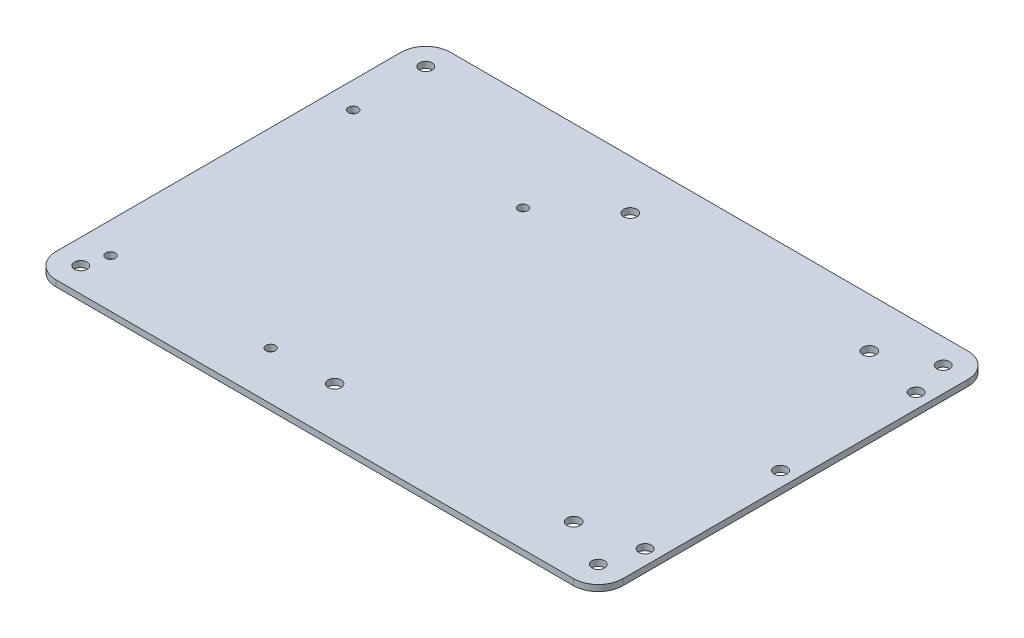
ISO-10303-21;
HEADER;
FILE_DESCRIPTION(('STEP AP214'),'2;1');
FILE_NAME('part.step','',(''),(''),'','','');
FILE_SCHEMA(('AUTOMOTIVE_DESIGN { 1 0 10303 214 1 1 1 1 }'));
ENDSEC;
DATA;
#1=APPLICATION_CONTEXT('core data for automotive mechanical design processes');
#2=APPLICATION_PROTOCOL_DEFINITION('international standard','automotive_design',2000,#1);
#3=PRODUCT_CONTEXT('',#1,'mechanical');
#4=PRODUCT('Part','Part','',(#3));
#5=PRODUCT_RELATED_PRODUCT_CATEGORY('part','',(#4));
#6=PRODUCT_DEFINITION_FORMATION('','',#4);
#7=PRODUCT_DEFINITION_CONTEXT('part definition',#1,'design');
#8=PRODUCT_DEFINITION('design','',#6,#7);
#9=PRODUCT_DEFINITION_SHAPE('','',#8);
#10=(LENGTH_UNIT() NAMED_UNIT(*) SI_UNIT(.MILLI.,.METRE.));
#11=(NAMED_UNIT(*) PLANE_ANGLE_UNIT() SI_UNIT($,.RADIAN.));
#12=(NAMED_UNIT(*) SI_UNIT($,.STERADIAN.) SOLID_ANGLE_UNIT());
#13=UNCERTAINTY_MEASURE_WITH_UNIT(LENGTH_MEASURE(1.E-05),#10,'distance_accuracy_value','');
#14=(GEOMETRIC_REPRESENTATION_CONTEXT(3) GLOBAL_UNCERTAINTY_ASSIGNED_CONTEXT((#13)) GLOBAL_UNIT_ASSIGNED_CONTEXT((#10,
#11,#12)) REPRESENTATION_CONTEXT('',''));
#15=CARTESIAN_POINT('',(0.,0.,0.));
#16=DIRECTION('',(0.,0.,1.));
#17=DIRECTION('',(1.,0.,0.));
#18=AXIS2_PLACEMENT_3D('',#15,#16,#17);
#19=CARTESIAN_POINT('',(73.0249999999999,1.5875,-50.8));
#20=DIRECTION('',(0.,-1.,0.));
#21=DIRECTION('',(0.,0.,-1.));
#22=AXIS2_PLACEMENT_3D('',#19,#20,#21);
#23=PLANE('',#22);
#24=CARTESIAN_POINT('',(-66.3194,1.5875,-25.4));
#25=DIRECTION('',(0.,-1.,0.));
#26=DIRECTION('',(0.,0.,-1.));
#27=AXIS2_PLACEMENT_3D('',#24,#25,#26);
#28=CIRCLE('',#27,1.2192);
#29=CARTESIAN_POINT('',(-66.3194,1.5875,-26.6192));
#30=VERTEX_POINT('',#29);
#31=EDGE_CURVE('E420',#30,#30,#28,.T.);
#32=ORIENTED_EDGE('',*,*,#31,.T.);
#33=EDGE_LOOP('',(#32));
#34=FACE_BOUND('',#33,.T.);
#35=CARTESIAN_POINT('',(-22.5806,1.5875,-25.4));
#36=DIRECTION('',(0.,-1.,0.));
#37=DIRECTION('',(0.,0.,-1.));
#38=AXIS2_PLACEMENT_3D('',#35,#36,#37);
#39=CIRCLE('',#38,1.21919999999999);
#40=CARTESIAN_POINT('',(-22.5806,1.5875,-26.6192));
#41=VERTEX_POINT('',#40);
#42=EDGE_CURVE('E430',#41,#41,#39,.T.);
#43=ORIENTED_EDGE('',*,*,#42,.T.);
#44=EDGE_LOOP('',(#43));
#45=FACE_BOUND('',#44,.T.);
#46=CARTESIAN_POINT('',(-65.0875,1.5875,38.3794));
#47=DIRECTION('',(0.,-1.,0.));
#48=DIRECTION('',(0.,0.,-1.));
#49=AXIS2_PLACEMENT_3D('',#46,#47,#48);
#50=CIRCLE('',#49,1.2192);
#51=CARTESIAN_POINT('',(-65.0875,1.5875,37.1602));
#52=VERTEX_POINT('',#51);
#53=EDGE_CURVE('E436',#52,#52,#50,.T.);
#54=ORIENTED_EDGE('',*,*,#53,.T.);
#55=EDGE_LOOP('',(#54));
#56=FACE_BOUND('',#55,.T.);
#57=CARTESIAN_POINT('',(-23.8125,1.5875,38.3794));
#58=DIRECTION('',(0.,-1.,0.));
#59=DIRECTION('',(0.,0.,-1.));
#60=AXIS2_PLACEMENT_3D('',#57,#58,#59);
#61=CIRCLE('',#60,1.21919999999999);
#62=CARTESIAN_POINT('',(-23.8125,1.5875,37.1602));
#63=VERTEX_POINT('',#62);
#64=EDGE_CURVE('E442',#63,#63,#61,.T.);
#65=ORIENTED_EDGE('',*,*,#64,.T.);
#66=EDGE_LOOP('',(#65));
#67=FACE_BOUND('',#66,.T.);
#68=CARTESIAN_POINT('',(69.215,1.5875,34.925));
#69=DIRECTION('',(0.,1.,0.));
#70=DIRECTION('',(0.,0.,1.));
#71=AXIS2_PLACEMENT_3D('',#68,#69,#70);
#72=CIRCLE('',#71,1.63194999999999);
#73=CARTESIAN_POINT('',(69.215,1.5875,36.55695));
#74=VERTEX_POINT('',#73);
#75=EDGE_CURVE('E451',#74,#74,#72,.T.);
#76=ORIENTED_EDGE('',*,*,#75,.F.);
#77=EDGE_LOOP('',(#76));
#78=FACE_BOUND('',#77,.T.);
#79=CARTESIAN_POINT('',(-7.62000000000004,1.5875,-38.1));
#80=DIRECTION('',(0.,1.,0.));
#81=DIRECTION('',(0.,0.,1.));
#82=AXIS2_PLACEMENT_3D('',#79,#80,#81);
#83=CIRCLE('',#82,1.69999999999999);
#84=CARTESIAN_POINT('',(-7.62000000000004,1.5875,-36.4));
#85=VERTEX_POINT('',#84);
#86=EDGE_CURVE('E463',#85,#85,#83,.T.);
#87=ORIENTED_EDGE('',*,*,#86,.F.);
#88=EDGE_LOOP('',(#87));
#89=FACE_BOUND('',#88,.T.);
#90=CARTESIAN_POINT('',(-7.62000000000004,1.5875,38.1));
#91=DIRECTION('',(0.,1.,0.));
#92=DIRECTION('',(0.,0.,1.));
#93=AXIS2_PLACEMENT_3D('',#90,#91,#92);
#94=CIRCLE('',#93,1.69999999999999);
#95=CARTESIAN_POINT('',(-7.62000000000004,1.5875,39.8));
#96=VERTEX_POINT('',#95);
#97=EDGE_CURVE('E475',#96,#96,#94,.T.);
#98=ORIENTED_EDGE('',*,*,#97,.F.);
#99=EDGE_LOOP('',(#98));
#100=FACE_BOUND('',#99,.T.);
#101=DIRECTION('',(-1.,0.,0.));
#102=VECTOR('',#101,1.);
#103=CARTESIAN_POINT('',(-73.025,1.5875,-50.8));
#104=LINE('',#103,#102);
#105=CARTESIAN_POINT('',(66.675,1.5875,-50.8));
#106=VERTEX_POINT('',#105);
#107=CARTESIAN_POINT('',(-66.675,1.5875,-50.8));
#108=VERTEX_POINT('',#107);
#109=EDGE_CURVE('E183',#106,#108,#104,.T.);
#110=ORIENTED_EDGE('',*,*,#109,.T.);
#111=CARTESIAN_POINT('',(-66.675,1.5875,-44.45));
#112=DIRECTION('',(0.,-1.,0.));
#113=DIRECTION('',(0.,0.,-1.));
#114=AXIS2_PLACEMENT_3D('',#111,#112,#113);
#115=CIRCLE('',#114,6.35);
#116=CARTESIAN_POINT('',(-73.025,1.5875,-44.45));
#117=VERTEX_POINT('',#116);
#118=EDGE_CURVE('E148',#108,#117,#115,.F.);
#119=ORIENTED_EDGE('',*,*,#118,.T.);
#120=DIRECTION('',(0.,0.,1.));
#121=VECTOR('',#120,1.);
#122=CARTESIAN_POINT('',(-73.025,1.5875,50.8));
#123=LINE('',#122,#121);
#124=CARTESIAN_POINT('',(-73.025,1.5875,44.45));
#125=VERTEX_POINT('',#124);
#126=EDGE_CURVE('E119',#117,#125,#123,.T.);
#127=ORIENTED_EDGE('',*,*,#126,.T.);
#128=CARTESIAN_POINT('',(-66.675,1.5875,44.45));
#129=DIRECTION('',(0.,-1.,0.));
#130=DIRECTION('',(0.,0.,-1.));
#131=AXIS2_PLACEMENT_3D('',#128,#129,#130);
#132=CIRCLE('',#131,6.35);
#133=CARTESIAN_POINT('',(-66.675,1.5875,50.8));
#134=VERTEX_POINT('',#133);
#135=EDGE_CURVE('E55',#125,#134,#132,.F.);
#136=ORIENTED_EDGE('',*,*,#135,.T.);
#137=DIRECTION('',(1.,0.,0.));
#138=VECTOR('',#137,1.);
#139=CARTESIAN_POINT('',(-73.025,1.5875,50.8));
#140=LINE('',#139,#138);
#141=CARTESIAN_POINT('',(66.675,1.5875,50.8));
#142=VERTEX_POINT('',#141);
#143=EDGE_CURVE('E135',#134,#142,#140,.T.);
#144=ORIENTED_EDGE('',*,*,#143,.T.);
#145=CARTESIAN_POINT('',(66.675,1.5875,44.45));
#146=DIRECTION('',(0.,-1.,0.));
#147=DIRECTION('',(0.,0.,-1.));
#148=AXIS2_PLACEMENT_3D('',#145,#146,#147);
#149=CIRCLE('',#148,6.35);
#150=CARTESIAN_POINT('',(73.0249999999999,1.5875,44.45));
#151=VERTEX_POINT('',#150);
#152=EDGE_CURVE('E143',#142,#151,#149,.F.);
#153=ORIENTED_EDGE('',*,*,#152,.T.);
#154=DIRECTION('',(0.,0.,-1.));
#155=VECTOR('',#154,1.);
#156=CARTESIAN_POINT('',(73.0249999999999,1.5875,50.8));
#157=LINE('',#156,#155);
#158=CARTESIAN_POINT('',(73.0249999999999,1.5875,-44.45));
#159=VERTEX_POINT('',#158);
#160=EDGE_CURVE('E129',#151,#159,#157,.T.);
#161=ORIENTED_EDGE('',*,*,#160,.T.);
#162=CARTESIAN_POINT('',(66.675,1.5875,-44.45));
#163=DIRECTION('',(0.,-1.,0.));
#164=DIRECTION('',(0.,0.,-1.));
#165=AXIS2_PLACEMENT_3D('',#162,#163,#164);
#166=CIRCLE('',#165,6.35);
#167=EDGE_CURVE('E146',#159,#106,#166,.F.);
#168=ORIENTED_EDGE('',*,*,#167,.T.);
#169=EDGE_LOOP('',(#110,#119,#127,#136,#144,#153,#161,#168));
#170=FACE_BOUND('',#169,.T.);
#171=CARTESIAN_POINT('',(-66.675,1.5875,44.45));
#172=DIRECTION('',(0.,1.,0.));
#173=DIRECTION('',(0.,0.,1.));
#174=AXIS2_PLACEMENT_3D('',#171,#172,#173);
#175=CIRCLE('',#174,1.63194999999999);
#176=CARTESIAN_POINT('',(-66.675,1.5875,46.08195));
#177=VERTEX_POINT('',#176);
#178=EDGE_CURVE('E159',#177,#177,#175,.T.);
#179=ORIENTED_EDGE('',*,*,#178,.F.);
#180=EDGE_LOOP('',(#179));
#181=FACE_BOUND('',#180,.T.);
#182=CARTESIAN_POINT('',(-66.675,1.5875,-44.45));
#183=DIRECTION('',(0.,1.,0.));
#184=DIRECTION('',(0.,0.,1.));
#185=AXIS2_PLACEMENT_3D('',#182,#183,#184);
#186=CIRCLE('',#185,1.63194999999999);
#187=CARTESIAN_POINT('',(-66.675,1.5875,-42.81805));
#188=VERTEX_POINT('',#187);
#189=EDGE_CURVE('E162',#188,#188,#186,.T.);
#190=ORIENTED_EDGE('',*,*,#189,.F.);
#191=EDGE_LOOP('',(#190));
#192=FACE_BOUND('',#191,.T.);
#193=CARTESIAN_POINT('',(66.675,1.5875,-44.45));
#194=DIRECTION('',(0.,1.,0.));
#195=DIRECTION('',(0.,0.,1.));
#196=AXIS2_PLACEMENT_3D('',#193,#194,#195);
#197=CIRCLE('',#196,1.63194999999999);
#198=CARTESIAN_POINT('',(66.675,1.5875,-42.81805));
#199=VERTEX_POINT('',#198);
#200=EDGE_CURVE('E165',#199,#199,#197,.T.);
#201=ORIENTED_EDGE('',*,*,#200,.F.);
#202=EDGE_LOOP('',(#201));
#203=FACE_BOUND('',#202,.T.);
#204=CARTESIAN_POINT('',(66.675,1.5875,44.45));
#205=DIRECTION('',(0.,1.,0.));
#206=DIRECTION('',(0.,0.,1.));
#207=AXIS2_PLACEMENT_3D('',#204,#205,#206);
#208=CIRCLE('',#207,1.63194999999999);
#209=CARTESIAN_POINT('',(66.675,1.5875,46.08195));
#210=VERTEX_POINT('',#209);
#211=EDGE_CURVE('E175',#210,#210,#208,.T.);
#212=ORIENTED_EDGE('',*,*,#211,.F.);
#213=EDGE_LOOP('',(#212));
#214=FACE_BOUND('',#213,.T.);
#215=CARTESIAN_POINT('',(53.975,1.5875,38.1));
#216=DIRECTION('',(0.,1.,0.));
#217=DIRECTION('',(0.,0.,1.));
#218=AXIS2_PLACEMENT_3D('',#215,#216,#217);
#219=CIRCLE('',#218,1.69999999999999);
#220=CARTESIAN_POINT('',(53.975,1.5875,39.8));
#221=VERTEX_POINT('',#220);
#222=EDGE_CURVE('E481',#221,#221,#219,.T.);
#223=ORIENTED_EDGE('',*,*,#222,.F.);
#224=EDGE_LOOP('',(#223));
#225=FACE_BOUND('',#224,.T.);
#226=CARTESIAN_POINT('',(53.975,1.5875,-38.1));
#227=DIRECTION('',(0.,1.,0.));
#228=DIRECTION('',(0.,0.,1.));
#229=AXIS2_PLACEMENT_3D('',#226,#227,#228);
#230=CIRCLE('',#229,1.69999999999999);
#231=CARTESIAN_POINT('',(53.975,1.5875,-36.4));
#232=VERTEX_POINT('',#231);
#233=EDGE_CURVE('E469',#232,#232,#230,.T.);
#234=ORIENTED_EDGE('',*,*,#233,.F.);
#235=EDGE_LOOP('',(#234));
#236=FACE_BOUND('',#235,.T.);
#237=CARTESIAN_POINT('',(69.2149999999999,1.5875,-34.925));
#238=DIRECTION('',(0.,1.,0.));
#239=DIRECTION('',(0.,0.,1.));
#240=AXIS2_PLACEMENT_3D('',#237,#238,#239);
#241=CIRCLE('',#240,1.63194999999999);
#242=CARTESIAN_POINT('',(69.2149999999999,1.5875,-33.29305));
#243=VERTEX_POINT('',#242);
#244=EDGE_CURVE('E457',#243,#243,#241,.T.);
#245=ORIENTED_EDGE('',*,*,#244,.F.);
#246=EDGE_LOOP('',(#245));
#247=FACE_BOUND('',#246,.T.);
#248=CARTESIAN_POINT('',(69.215,1.5875,0.));
#249=DIRECTION('',(0.,1.,0.));
#250=DIRECTION('',(0.,0.,1.));
#251=AXIS2_PLACEMENT_3D('',#248,#249,#250);
#252=CIRCLE('',#251,1.63194999999999);
#253=CARTESIAN_POINT('',(69.215,1.5875,1.63194999999999));
#254=VERTEX_POINT('',#253);
#255=EDGE_CURVE('E445',#254,#254,#252,.T.);
#256=ORIENTED_EDGE('',*,*,#255,.F.);
#257=EDGE_LOOP('',(#256));
#258=FACE_BOUND('',#257,.T.);
#259=ADVANCED_FACE('F32',(#34,#45,#56,#67,#78,#89,#100,#170,#181,#192,#203,#214,#225,#236,#247,
#258),#23,.F.);
#260=CARTESIAN_POINT('',(73.0249999999999,1.5875,50.8));
#261=DIRECTION('',(-1.,0.,0.));
#262=DIRECTION('',(0.,0.,1.));
#263=AXIS2_PLACEMENT_3D('',#260,#261,#262);
#264=PLANE('',#263);
#265=DIRECTION('',(0.,0.,-1.));
#266=VECTOR('',#265,1.);
#267=CARTESIAN_POINT('',(73.0249999999999,0.,50.8));
#268=LINE('',#267,#266);
#269=CARTESIAN_POINT('',(73.0249999999999,0.,44.45));
#270=VERTEX_POINT('',#269);
#271=CARTESIAN_POINT('',(73.0249999999999,0.,-44.45));
#272=VERTEX_POINT('',#271);
#273=EDGE_CURVE('E131',#270,#272,#268,.T.);
#274=ORIENTED_EDGE('',*,*,#273,.T.);
#275=DIRECTION('',(0.,-1.,0.));
#276=VECTOR('',#275,1.);
#277=CARTESIAN_POINT('',(73.0249999999999,1.5875,-44.45));
#278=LINE('',#277,#276);
#279=EDGE_CURVE('E153',#272,#159,#278,.F.);
#280=ORIENTED_EDGE('',*,*,#279,.T.);
#281=ORIENTED_EDGE('',*,*,#160,.F.);
#282=DIRECTION('',(0.,-1.,0.));
#283=VECTOR('',#282,1.);
#284=CARTESIAN_POINT('',(73.0249999999999,1.5875,44.45));
#285=LINE('',#284,#283);
#286=EDGE_CURVE('E150',#151,#270,#285,.T.);
#287=ORIENTED_EDGE('',*,*,#286,.T.);
#288=EDGE_LOOP('',(#274,#280,#281,#287));
#289=FACE_BOUND('',#288,.T.);
#290=ADVANCED_FACE('F191',(#289),#264,.F.);
#291=CARTESIAN_POINT('',(-73.025,1.5875,-50.8));
#292=DIRECTION('',(0.,0.,1.));
#293=DIRECTION('',(1.,0.,0.));
#294=AXIS2_PLACEMENT_3D('',#291,#292,#293);
#295=PLANE('',#294);
#296=DIRECTION('',(-1.,0.,0.));
#297=VECTOR('',#296,1.);
#298=CARTESIAN_POINT('',(-73.025,0.,-50.8));
#299=LINE('',#298,#297);
#300=CARTESIAN_POINT('',(66.675,0.,-50.8));
#301=VERTEX_POINT('',#300);
#302=CARTESIAN_POINT('',(-66.675,0.,-50.8));
#303=VERTEX_POINT('',#302);
#304=EDGE_CURVE('E127',#301,#303,#299,.T.);
#305=ORIENTED_EDGE('',*,*,#304,.T.);
#306=DIRECTION('',(0.,-1.,0.));
#307=VECTOR('',#306,1.);
#308=CARTESIAN_POINT('',(-66.675,1.5875,-50.8));
#309=LINE('',#308,#307);
#310=EDGE_CURVE('E105',#303,#108,#309,.F.);
#311=ORIENTED_EDGE('',*,*,#310,.T.);
#312=ORIENTED_EDGE('',*,*,#109,.F.);
#313=DIRECTION('',(0.,-1.,0.));
#314=VECTOR('',#313,1.);
#315=CARTESIAN_POINT('',(66.675,1.5875,-50.8));
#316=LINE('',#315,#314);
#317=EDGE_CURVE('E110',#106,#301,#316,.T.);
#318=ORIENTED_EDGE('',*,*,#317,.T.);
#319=EDGE_LOOP('',(#305,#311,#312,#318));
#320=FACE_BOUND('',#319,.T.);
#321=ADVANCED_FACE('F201',(#320),#295,.F.);
#322=CARTESIAN_POINT('',(-73.025,1.5875,50.8));
#323=DIRECTION('',(1.,0.,0.));
#324=DIRECTION('',(0.,0.,-1.));
#325=AXIS2_PLACEMENT_3D('',#322,#323,#324);
#326=PLANE('',#325);
#327=ORIENTED_EDGE('',*,*,#126,.F.);
#328=DIRECTION('',(0.,-1.,0.));
#329=VECTOR('',#328,1.);
#330=CARTESIAN_POINT('',(-73.025,1.5875,-44.45));
#331=LINE('',#330,#329);
#332=CARTESIAN_POINT('',(-73.025,0.,-44.45));
#333=VERTEX_POINT('',#332);
#334=EDGE_CURVE('E104',#117,#333,#331,.T.);
#335=ORIENTED_EDGE('',*,*,#334,.T.);
#336=DIRECTION('',(0.,0.,1.));
#337=VECTOR('',#336,1.);
#338=CARTESIAN_POINT('',(-73.025,0.,50.8));
#339=LINE('',#338,#337);
#340=CARTESIAN_POINT('',(-73.025,0.,44.45));
#341=VERTEX_POINT('',#340);
#342=EDGE_CURVE('E117',#333,#341,#339,.T.);
#343=ORIENTED_EDGE('',*,*,#342,.T.);
#344=DIRECTION('',(0.,-1.,0.));
#345=VECTOR('',#344,1.);
#346=CARTESIAN_POINT('',(-73.025,1.5875,44.45));
#347=LINE('',#346,#345);
#348=EDGE_CURVE('E121',#341,#125,#347,.F.);
#349=ORIENTED_EDGE('',*,*,#348,.T.);
#350=EDGE_LOOP('',(#327,#335,#343,#349));
#351=FACE_BOUND('',#350,.T.);
#352=ADVANCED_FACE('F116',(#351),#326,.F.);
#353=CARTESIAN_POINT('',(-73.025,1.5875,50.8));
#354=DIRECTION('',(0.,0.,-1.));
#355=DIRECTION('',(-1.,0.,0.));
#356=AXIS2_PLACEMENT_3D('',#353,#354,#355);
#357=PLANE('',#356);
#358=ORIENTED_EDGE('',*,*,#143,.F.);
#359=DIRECTION('',(0.,-1.,0.));
#360=VECTOR('',#359,1.);
#361=CARTESIAN_POINT('',(-66.675,1.5875,50.8));
#362=LINE('',#361,#360);
#363=CARTESIAN_POINT('',(-66.675,0.,50.8));
#364=VERTEX_POINT('',#363);
#365=EDGE_CURVE('E11',#134,#364,#362,.T.);
#366=ORIENTED_EDGE('',*,*,#365,.T.);
#367=DIRECTION('',(1.,0.,0.));
#368=VECTOR('',#367,1.);
#369=CARTESIAN_POINT('',(-73.025,0.,50.8));
#370=LINE('',#369,#368);
#371=CARTESIAN_POINT('',(66.675,0.,50.8));
#372=VERTEX_POINT('',#371);
#373=EDGE_CURVE('E126',#364,#372,#370,.T.);
#374=ORIENTED_EDGE('',*,*,#373,.T.);
#375=DIRECTION('',(0.,-1.,0.));
#376=VECTOR('',#375,1.);
#377=CARTESIAN_POINT('',(66.675,1.5875,50.8));
#378=LINE('',#377,#376);
#379=EDGE_CURVE('E41',#372,#142,#378,.F.);
#380=ORIENTED_EDGE('',*,*,#379,.T.);
#381=EDGE_LOOP('',(#358,#366,#374,#380));
#382=FACE_BOUND('',#381,.T.);
#383=ADVANCED_FACE('F208',(#382),#357,.F.);
#384=CARTESIAN_POINT('',(73.0249999999999,0.,-50.8));
#385=DIRECTION('',(0.,-1.,0.));
#386=DIRECTION('',(0.,0.,-1.));
#387=AXIS2_PLACEMENT_3D('',#384,#385,#386);
#388=PLANE('',#387);
#389=CARTESIAN_POINT('',(-66.3194,0.,-25.4));
#390=DIRECTION('',(0.,-1.,0.));
#391=DIRECTION('',(0.,0.,-1.));
#392=AXIS2_PLACEMENT_3D('',#389,#390,#391);
#393=CIRCLE('',#392,1.21919999999999);
#394=CARTESIAN_POINT('',(-66.3194,0.,-26.6192));
#395=VERTEX_POINT('',#394);
#396=EDGE_CURVE('E423',#395,#395,#393,.T.);
#397=ORIENTED_EDGE('',*,*,#396,.F.);
#398=EDGE_LOOP('',(#397));
#399=FACE_BOUND('',#398,.T.);
#400=CARTESIAN_POINT('',(-22.5806,0.,-25.4));
#401=DIRECTION('',(0.,-1.,0.));
#402=DIRECTION('',(0.,0.,-1.));
#403=AXIS2_PLACEMENT_3D('',#400,#401,#402);
#404=CIRCLE('',#403,1.21919999999999);
#405=CARTESIAN_POINT('',(-22.5806,0.,-26.6192));
#406=VERTEX_POINT('',#405);
#407=EDGE_CURVE('E425',#406,#406,#404,.T.);
#408=ORIENTED_EDGE('',*,*,#407,.F.);
#409=EDGE_LOOP('',(#408));
#410=FACE_BOUND('',#409,.T.);
#411=CARTESIAN_POINT('',(-65.0875,0.,38.3794));
#412=DIRECTION('',(0.,-1.,0.));
#413=DIRECTION('',(0.,0.,-1.));
#414=AXIS2_PLACEMENT_3D('',#411,#412,#413);
#415=CIRCLE('',#414,1.21919999999999);
#416=CARTESIAN_POINT('',(-65.0875,0.,37.1602));
#417=VERTEX_POINT('',#416);
#418=EDGE_CURVE('E433',#417,#417,#415,.T.);
#419=ORIENTED_EDGE('',*,*,#418,.F.);
#420=EDGE_LOOP('',(#419));
#421=FACE_BOUND('',#420,.T.);
#422=CARTESIAN_POINT('',(-23.8125,0.,38.3794));
#423=DIRECTION('',(0.,-1.,0.));
#424=DIRECTION('',(0.,0.,-1.));
#425=AXIS2_PLACEMENT_3D('',#422,#423,#424);
#426=CIRCLE('',#425,1.21919999999999);
#427=CARTESIAN_POINT('',(-23.8125,0.,37.1602));
#428=VERTEX_POINT('',#427);
#429=EDGE_CURVE('E439',#428,#428,#426,.T.);
#430=ORIENTED_EDGE('',*,*,#429,.F.);
#431=EDGE_LOOP('',(#430));
#432=FACE_BOUND('',#431,.T.);
#433=CARTESIAN_POINT('',(69.215,0.,0.));
#434=DIRECTION('',(0.,-1.,0.));
#435=DIRECTION('',(0.,0.,-1.));
#436=AXIS2_PLACEMENT_3D('',#433,#434,#435);
#437=CIRCLE('',#436,1.63194999999999);
#438=CARTESIAN_POINT('',(69.215,0.,-1.63194999999999));
#439=VERTEX_POINT('',#438);
#440=EDGE_CURVE('E448',#439,#439,#437,.T.);
#441=ORIENTED_EDGE('',*,*,#440,.F.);
#442=EDGE_LOOP('',(#441));
#443=FACE_BOUND('',#442,.T.);
#444=CARTESIAN_POINT('',(69.215,0.,34.925));
#445=DIRECTION('',(0.,-1.,0.));
#446=DIRECTION('',(0.,0.,-1.));
#447=AXIS2_PLACEMENT_3D('',#444,#445,#446);
#448=CIRCLE('',#447,1.63194999999999);
#449=CARTESIAN_POINT('',(69.215,0.,33.29305));
#450=VERTEX_POINT('',#449);
#451=EDGE_CURVE('E454',#450,#450,#448,.T.);
#452=ORIENTED_EDGE('',*,*,#451,.F.);
#453=EDGE_LOOP('',(#452));
#454=FACE_BOUND('',#453,.T.);
#455=CARTESIAN_POINT('',(69.2149999999999,0.,-34.925));
#456=DIRECTION('',(0.,-1.,0.));
#457=DIRECTION('',(0.,0.,-1.));
#458=AXIS2_PLACEMENT_3D('',#455,#456,#457);
#459=CIRCLE('',#458,1.63194999999999);
#460=CARTESIAN_POINT('',(69.2149999999999,0.,-36.55695));
#461=VERTEX_POINT('',#460);
#462=EDGE_CURVE('E460',#461,#461,#459,.T.);
#463=ORIENTED_EDGE('',*,*,#462,.F.);
#464=EDGE_LOOP('',(#463));
#465=FACE_BOUND('',#464,.T.);
#466=CARTESIAN_POINT('',(-7.62000000000004,0.,-38.1));
#467=DIRECTION('',(0.,-1.,0.));
#468=DIRECTION('',(0.,0.,-1.));
#469=AXIS2_PLACEMENT_3D('',#466,#467,#468);
#470=CIRCLE('',#469,1.69999999999999);
#471=CARTESIAN_POINT('',(-7.62000000000004,0.,-39.8));
#472=VERTEX_POINT('',#471);
#473=EDGE_CURVE('E466',#472,#472,#470,.T.);
#474=ORIENTED_EDGE('',*,*,#473,.F.);
#475=EDGE_LOOP('',(#474));
#476=FACE_BOUND('',#475,.T.);
#477=CARTESIAN_POINT('',(53.975,0.,-38.1));
#478=DIRECTION('',(0.,-1.,0.));
#479=DIRECTION('',(0.,0.,-1.));
#480=AXIS2_PLACEMENT_3D('',#477,#478,#479);
#481=CIRCLE('',#480,1.69999999999999);
#482=CARTESIAN_POINT('',(53.975,0.,-39.8));
#483=VERTEX_POINT('',#482);
#484=EDGE_CURVE('E472',#483,#483,#481,.T.);
#485=ORIENTED_EDGE('',*,*,#484,.F.);
#486=EDGE_LOOP('',(#485));
#487=FACE_BOUND('',#486,.T.);
#488=CARTESIAN_POINT('',(-7.62000000000004,0.,38.1));
#489=DIRECTION('',(0.,-1.,0.));
#490=DIRECTION('',(0.,0.,-1.));
#491=AXIS2_PLACEMENT_3D('',#488,#489,#490);
#492=CIRCLE('',#491,1.69999999999999);
#493=CARTESIAN_POINT('',(-7.62000000000004,0.,36.4));
#494=VERTEX_POINT('',#493);
#495=EDGE_CURVE('E478',#494,#494,#492,.T.);
#496=ORIENTED_EDGE('',*,*,#495,.F.);
#497=EDGE_LOOP('',(#496));
#498=FACE_BOUND('',#497,.T.);
#499=CARTESIAN_POINT('',(53.975,0.,38.1));
#500=DIRECTION('',(0.,-1.,0.));
#501=DIRECTION('',(0.,0.,-1.));
#502=AXIS2_PLACEMENT_3D('',#499,#500,#501);
#503=CIRCLE('',#502,1.69999999999999);
#504=CARTESIAN_POINT('',(53.975,0.,36.4));
#505=VERTEX_POINT('',#504);
#506=EDGE_CURVE('E483',#505,#505,#503,.T.);
#507=ORIENTED_EDGE('',*,*,#506,.F.);
#508=EDGE_LOOP('',(#507));
#509=FACE_BOUND('',#508,.T.);
#510=CARTESIAN_POINT('',(66.675,0.,44.45));
#511=DIRECTION('',(0.,-1.,0.));
#512=DIRECTION('',(0.,0.,-1.));
#513=AXIS2_PLACEMENT_3D('',#510,#511,#512);
#514=CIRCLE('',#513,1.63194999999999);
#515=CARTESIAN_POINT('',(66.675,0.,42.81805));
#516=VERTEX_POINT('',#515);
#517=EDGE_CURVE('E36',#516,#516,#514,.T.);
#518=ORIENTED_EDGE('',*,*,#517,.F.);
#519=EDGE_LOOP('',(#518));
#520=FACE_BOUND('',#519,.T.);
#521=CARTESIAN_POINT('',(66.675,0.,-44.45));
#522=DIRECTION('',(0.,-1.,0.));
#523=DIRECTION('',(0.,0.,-1.));
#524=AXIS2_PLACEMENT_3D('',#521,#522,#523);
#525=CIRCLE('',#524,1.63194999999999);
#526=CARTESIAN_POINT('',(66.675,0.,-46.08195));
#527=VERTEX_POINT('',#526);
#528=EDGE_CURVE('E163',#527,#527,#525,.T.);
#529=ORIENTED_EDGE('',*,*,#528,.F.);
#530=EDGE_LOOP('',(#529));
#531=FACE_BOUND('',#530,.T.);
#532=CARTESIAN_POINT('',(-66.675,0.,-44.45));
#533=DIRECTION('',(0.,-1.,0.));
#534=DIRECTION('',(0.,0.,-1.));
#535=AXIS2_PLACEMENT_3D('',#532,#533,#534);
#536=CIRCLE('',#535,1.63194999999999);
#537=CARTESIAN_POINT('',(-66.675,0.,-46.08195));
#538=VERTEX_POINT('',#537);
#539=EDGE_CURVE('E160',#538,#538,#536,.T.);
#540=ORIENTED_EDGE('',*,*,#539,.F.);
#541=EDGE_LOOP('',(#540));
#542=FACE_BOUND('',#541,.T.);
#543=CARTESIAN_POINT('',(-66.675,0.,44.45));
#544=DIRECTION('',(0.,-1.,0.));
#545=DIRECTION('',(0.,0.,-1.));
#546=AXIS2_PLACEMENT_3D('',#543,#544,#545);
#547=CIRCLE('',#546,1.63194999999999);
#548=CARTESIAN_POINT('',(-66.675,0.,42.81805));
#549=VERTEX_POINT('',#548);
#550=EDGE_CURVE('E156',#549,#549,#547,.T.);
#551=ORIENTED_EDGE('',*,*,#550,.F.);
#552=EDGE_LOOP('',(#551));
#553=FACE_BOUND('',#552,.T.);
#554=ORIENTED_EDGE('',*,*,#342,.F.);
#555=CARTESIAN_POINT('',(-66.675,0.,-44.45));
#556=DIRECTION('',(0.,-1.,0.));
#557=DIRECTION('',(0.,0.,-1.));
#558=AXIS2_PLACEMENT_3D('',#555,#556,#557);
#559=CIRCLE('',#558,6.35);
#560=EDGE_CURVE('E100',#333,#303,#559,.T.);
#561=ORIENTED_EDGE('',*,*,#560,.T.);
#562=ORIENTED_EDGE('',*,*,#304,.F.);
#563=CARTESIAN_POINT('',(66.675,0.,-44.45));
#564=DIRECTION('',(0.,-1.,0.));
#565=DIRECTION('',(0.,0.,-1.));
#566=AXIS2_PLACEMENT_3D('',#563,#564,#565);
#567=CIRCLE('',#566,6.35);
#568=EDGE_CURVE('E111',#301,#272,#567,.T.);
#569=ORIENTED_EDGE('',*,*,#568,.T.);
#570=ORIENTED_EDGE('',*,*,#273,.F.);
#571=CARTESIAN_POINT('',(66.675,0.,44.45));
#572=DIRECTION('',(0.,-1.,0.));
#573=DIRECTION('',(0.,0.,-1.));
#574=AXIS2_PLACEMENT_3D('',#571,#572,#573);
#575=CIRCLE('',#574,6.35);
#576=EDGE_CURVE('E120',#270,#372,#575,.T.);
#577=ORIENTED_EDGE('',*,*,#576,.T.);
#578=ORIENTED_EDGE('',*,*,#373,.F.);
#579=CARTESIAN_POINT('',(-66.675,0.,44.45));
#580=DIRECTION('',(0.,-1.,0.));
#581=DIRECTION('',(0.,0.,-1.));
#582=AXIS2_PLACEMENT_3D('',#579,#580,#581);
#583=CIRCLE('',#582,6.35);
#584=EDGE_CURVE('E125',#364,#341,#583,.T.);
#585=ORIENTED_EDGE('',*,*,#584,.T.);
#586=EDGE_LOOP('',(#554,#561,#562,#569,#570,#577,#578,#585));
#587=FACE_BOUND('',#586,.T.);
#588=ADVANCED_FACE('F123',(#399,#410,#421,#432,#443,#454,#465,#476,#487,#498,#509,#520,#531,
#542,#553,#587),#388,.T.);
#589=CARTESIAN_POINT('',(-66.675,1.5875,-44.45));
#590=DIRECTION('',(0.,-1.,0.));
#591=DIRECTION('',(0.,0.,-1.));
#592=AXIS2_PLACEMENT_3D('',#589,#590,#591);
#593=CYLINDRICAL_SURFACE('',#592,6.35);
#594=ORIENTED_EDGE('',*,*,#118,.F.);
#595=ORIENTED_EDGE('',*,*,#310,.F.);
#596=ORIENTED_EDGE('',*,*,#560,.F.);
#597=ORIENTED_EDGE('',*,*,#334,.F.);
#598=EDGE_LOOP('',(#594,#595,#596,#597));
#599=FACE_BOUND('',#598,.T.);
#600=ADVANCED_FACE('F103',(#599),#593,.T.);
#601=CARTESIAN_POINT('',(66.675,1.5875,-44.45));
#602=DIRECTION('',(0.,-1.,0.));
#603=DIRECTION('',(0.,0.,-1.));
#604=AXIS2_PLACEMENT_3D('',#601,#602,#603);
#605=CYLINDRICAL_SURFACE('',#604,6.35);
#606=ORIENTED_EDGE('',*,*,#167,.F.);
#607=ORIENTED_EDGE('',*,*,#279,.F.);
#608=ORIENTED_EDGE('',*,*,#568,.F.);
#609=ORIENTED_EDGE('',*,*,#317,.F.);
#610=EDGE_LOOP('',(#606,#607,#608,#609));
#611=FACE_BOUND('',#610,.T.);
#612=ADVANCED_FACE('F196',(#611),#605,.T.);
#613=CARTESIAN_POINT('',(-66.675,1.5875,44.45));
#614=DIRECTION('',(0.,-1.,0.));
#615=DIRECTION('',(0.,0.,-1.));
#616=AXIS2_PLACEMENT_3D('',#613,#614,#615);
#617=CYLINDRICAL_SURFACE('',#616,6.35);
#618=ORIENTED_EDGE('',*,*,#135,.F.);
#619=ORIENTED_EDGE('',*,*,#348,.F.);
#620=ORIENTED_EDGE('',*,*,#584,.F.);
#621=ORIENTED_EDGE('',*,*,#365,.F.);
#622=EDGE_LOOP('',(#618,#619,#620,#621));
#623=FACE_BOUND('',#622,.T.);
#624=ADVANCED_FACE('F231',(#623),#617,.T.);
#625=CARTESIAN_POINT('',(66.675,1.5875,44.45));
#626=DIRECTION('',(0.,-1.,0.));
#627=DIRECTION('',(0.,0.,-1.));
#628=AXIS2_PLACEMENT_3D('',#625,#626,#627);
#629=CYLINDRICAL_SURFACE('',#628,6.35);
#630=ORIENTED_EDGE('',*,*,#152,.F.);
#631=ORIENTED_EDGE('',*,*,#379,.F.);
#632=ORIENTED_EDGE('',*,*,#576,.F.);
#633=ORIENTED_EDGE('',*,*,#286,.F.);
#634=EDGE_LOOP('',(#630,#631,#632,#633));
#635=FACE_BOUND('',#634,.T.);
#636=ADVANCED_FACE('F34',(#635),#629,.T.);
#637=CARTESIAN_POINT('',(-66.675,1.5875,44.45));
#638=DIRECTION('',(0.,1.,0.));
#639=DIRECTION('',(0.,0.,1.));
#640=AXIS2_PLACEMENT_3D('',#637,#638,#639);
#641=CYLINDRICAL_SURFACE('',#640,1.63194999999999);
#642=ORIENTED_EDGE('',*,*,#550,.T.);
#643=EDGE_LOOP('',(#642));
#644=FACE_BOUND('',#643,.T.);
#645=ORIENTED_EDGE('',*,*,#178,.T.);
#646=EDGE_LOOP('',(#645));
#647=FACE_BOUND('',#646,.T.);
#648=ADVANCED_FACE('F220',(#644,#647),#641,.F.);
#649=CARTESIAN_POINT('',(-66.675,1.5875,-44.45));
#650=DIRECTION('',(0.,1.,0.));
#651=DIRECTION('',(0.,0.,1.));
#652=AXIS2_PLACEMENT_3D('',#649,#650,#651);
#653=CYLINDRICAL_SURFACE('',#652,1.63194999999999);
#654=ORIENTED_EDGE('',*,*,#539,.T.);
#655=EDGE_LOOP('',(#654));
#656=FACE_BOUND('',#655,.T.);
#657=ORIENTED_EDGE('',*,*,#189,.T.);
#658=EDGE_LOOP('',(#657));
#659=FACE_BOUND('',#658,.T.);
#660=ADVANCED_FACE('F268',(#656,#659),#653,.F.);
#661=CARTESIAN_POINT('',(66.675,1.5875,-44.45));
#662=DIRECTION('',(0.,1.,0.));
#663=DIRECTION('',(0.,0.,1.));
#664=AXIS2_PLACEMENT_3D('',#661,#662,#663);
#665=CYLINDRICAL_SURFACE('',#664,1.63194999999999);
#666=ORIENTED_EDGE('',*,*,#528,.T.);
#667=EDGE_LOOP('',(#666));
#668=FACE_BOUND('',#667,.T.);
#669=ORIENTED_EDGE('',*,*,#200,.T.);
#670=EDGE_LOOP('',(#669));
#671=FACE_BOUND('',#670,.T.);
#672=ADVANCED_FACE('F277',(#668,#671),#665,.F.);
#673=CARTESIAN_POINT('',(66.675,1.5875,44.45));
#674=DIRECTION('',(0.,1.,0.));
#675=DIRECTION('',(0.,0.,1.));
#676=AXIS2_PLACEMENT_3D('',#673,#674,#675);
#677=CYLINDRICAL_SURFACE('',#676,1.63194999999999);
#678=ORIENTED_EDGE('',*,*,#517,.T.);
#679=EDGE_LOOP('',(#678));
#680=FACE_BOUND('',#679,.T.);
#681=ORIENTED_EDGE('',*,*,#211,.T.);
#682=EDGE_LOOP('',(#681));
#683=FACE_BOUND('',#682,.T.);
#684=ADVANCED_FACE('F286',(#680,#683),#677,.F.);
#685=CARTESIAN_POINT('',(53.975,1.5875,38.1));
#686=DIRECTION('',(0.,1.,0.));
#687=DIRECTION('',(0.,0.,1.));
#688=AXIS2_PLACEMENT_3D('',#685,#686,#687);
#689=CYLINDRICAL_SURFACE('',#688,1.69999999999999);
#690=ORIENTED_EDGE('',*,*,#222,.T.);
#691=EDGE_LOOP('',(#690));
#692=FACE_BOUND('',#691,.T.);
#693=ORIENTED_EDGE('',*,*,#506,.T.);
#694=EDGE_LOOP('',(#693));
#695=FACE_BOUND('',#694,.T.);
#696=ADVANCED_FACE('F295',(#692,#695),#689,.F.);
#697=CARTESIAN_POINT('',(-7.62000000000004,1.5875,38.1));
#698=DIRECTION('',(0.,1.,0.));
#699=DIRECTION('',(0.,0.,1.));
#700=AXIS2_PLACEMENT_3D('',#697,#698,#699);
#701=CYLINDRICAL_SURFACE('',#700,1.69999999999999);
#702=ORIENTED_EDGE('',*,*,#97,.T.);
#703=EDGE_LOOP('',(#702));
#704=FACE_BOUND('',#703,.T.);
#705=ORIENTED_EDGE('',*,*,#495,.T.);
#706=EDGE_LOOP('',(#705));
#707=FACE_BOUND('',#706,.T.);
#708=ADVANCED_FACE('F305',(#704,#707),#701,.F.);
#709=CARTESIAN_POINT('',(53.975,1.5875,-38.1));
#710=DIRECTION('',(0.,1.,0.));
#711=DIRECTION('',(0.,0.,1.));
#712=AXIS2_PLACEMENT_3D('',#709,#710,#711);
#713=CYLINDRICAL_SURFACE('',#712,1.69999999999999);
#714=ORIENTED_EDGE('',*,*,#233,.T.);
#715=EDGE_LOOP('',(#714));
#716=FACE_BOUND('',#715,.T.);
#717=ORIENTED_EDGE('',*,*,#484,.T.);
#718=EDGE_LOOP('',(#717));
#719=FACE_BOUND('',#718,.T.);
#720=ADVANCED_FACE('F315',(#716,#719),#713,.F.);
#721=CARTESIAN_POINT('',(-7.62000000000004,1.5875,-38.1));
#722=DIRECTION('',(0.,1.,0.));
#723=DIRECTION('',(0.,0.,1.));
#724=AXIS2_PLACEMENT_3D('',#721,#722,#723);
#725=CYLINDRICAL_SURFACE('',#724,1.69999999999999);
#726=ORIENTED_EDGE('',*,*,#86,.T.);
#727=EDGE_LOOP('',(#726));
#728=FACE_BOUND('',#727,.T.);
#729=ORIENTED_EDGE('',*,*,#473,.T.);
#730=EDGE_LOOP('',(#729));
#731=FACE_BOUND('',#730,.T.);
#732=ADVANCED_FACE('F325',(#728,#731),#725,.F.);
#733=CARTESIAN_POINT('',(69.2149999999999,1.5875,-34.925));
#734=DIRECTION('',(0.,1.,0.));
#735=DIRECTION('',(0.,0.,1.));
#736=AXIS2_PLACEMENT_3D('',#733,#734,#735);
#737=CYLINDRICAL_SURFACE('',#736,1.63194999999999);
#738=ORIENTED_EDGE('',*,*,#244,.T.);
#739=EDGE_LOOP('',(#738));
#740=FACE_BOUND('',#739,.T.);
#741=ORIENTED_EDGE('',*,*,#462,.T.);
#742=EDGE_LOOP('',(#741));
#743=FACE_BOUND('',#742,.T.);
#744=ADVANCED_FACE('F335',(#740,#743),#737,.F.);
#745=CARTESIAN_POINT('',(69.215,1.5875,34.925));
#746=DIRECTION('',(0.,1.,0.));
#747=DIRECTION('',(0.,0.,1.));
#748=AXIS2_PLACEMENT_3D('',#745,#746,#747);
#749=CYLINDRICAL_SURFACE('',#748,1.63194999999999);
#750=ORIENTED_EDGE('',*,*,#75,.T.);
#751=EDGE_LOOP('',(#750));
#752=FACE_BOUND('',#751,.T.);
#753=ORIENTED_EDGE('',*,*,#451,.T.);
#754=EDGE_LOOP('',(#753));
#755=FACE_BOUND('',#754,.T.);
#756=ADVANCED_FACE('F346',(#752,#755),#749,.F.);
#757=CARTESIAN_POINT('',(69.215,1.5875,0.));
#758=DIRECTION('',(0.,1.,0.));
#759=DIRECTION('',(0.,0.,1.));
#760=AXIS2_PLACEMENT_3D('',#757,#758,#759);
#761=CYLINDRICAL_SURFACE('',#760,1.63194999999999);
#762=ORIENTED_EDGE('',*,*,#255,.T.);
#763=EDGE_LOOP('',(#762));
#764=FACE_BOUND('',#763,.T.);
#765=ORIENTED_EDGE('',*,*,#440,.T.);
#766=EDGE_LOOP('',(#765));
#767=FACE_BOUND('',#766,.T.);
#768=ADVANCED_FACE('F356',(#764,#767),#761,.F.);
#769=CARTESIAN_POINT('',(-23.8125,0.,38.3794));
#770=DIRECTION('',(0.,-1.,0.));
#771=DIRECTION('',(0.,0.,-1.));
#772=AXIS2_PLACEMENT_3D('',#769,#770,#771);
#773=CYLINDRICAL_SURFACE('',#772,1.21919999999999);
#774=ORIENTED_EDGE('',*,*,#64,.F.);
#775=EDGE_LOOP('',(#774));
#776=FACE_BOUND('',#775,.T.);
#777=ORIENTED_EDGE('',*,*,#429,.T.);
#778=EDGE_LOOP('',(#777));
#779=FACE_BOUND('',#778,.T.);
#780=ADVANCED_FACE('F365',(#776,#779),#773,.F.);
#781=CARTESIAN_POINT('',(-65.0875,0.,38.3794));
#782=DIRECTION('',(0.,-1.,0.));
#783=DIRECTION('',(0.,0.,-1.));
#784=AXIS2_PLACEMENT_3D('',#781,#782,#783);
#785=CYLINDRICAL_SURFACE('',#784,1.2192);
#786=ORIENTED_EDGE('',*,*,#53,.F.);
#787=EDGE_LOOP('',(#786));
#788=FACE_BOUND('',#787,.T.);
#789=ORIENTED_EDGE('',*,*,#418,.T.);
#790=EDGE_LOOP('',(#789));
#791=FACE_BOUND('',#790,.T.);
#792=ADVANCED_FACE('F384',(#788,#791),#785,.F.);
#793=CARTESIAN_POINT('',(-22.5806,0.,-25.4));
#794=DIRECTION('',(0.,-1.,0.));
#795=DIRECTION('',(0.,0.,-1.));
#796=AXIS2_PLACEMENT_3D('',#793,#794,#795);
#797=CYLINDRICAL_SURFACE('',#796,1.21919999999999);
#798=ORIENTED_EDGE('',*,*,#42,.F.);
#799=EDGE_LOOP('',(#798));
#800=FACE_BOUND('',#799,.T.);
#801=ORIENTED_EDGE('',*,*,#407,.T.);
#802=EDGE_LOOP('',(#801));
#803=FACE_BOUND('',#802,.T.);
#804=ADVANCED_FACE('F394',(#800,#803),#797,.F.);
#805=CARTESIAN_POINT('',(-66.3194,0.,-25.4));
#806=DIRECTION('',(0.,-1.,0.));
#807=DIRECTION('',(0.,0.,-1.));
#808=AXIS2_PLACEMENT_3D('',#805,#806,#807);
#809=CYLINDRICAL_SURFACE('',#808,1.2192);
#810=ORIENTED_EDGE('',*,*,#31,.F.);
#811=EDGE_LOOP('',(#810));
#812=FACE_BOUND('',#811,.T.);
#813=ORIENTED_EDGE('',*,*,#396,.T.);
#814=EDGE_LOOP('',(#813));
#815=FACE_BOUND('',#814,.T.);
#816=ADVANCED_FACE('F404',(#812,#815),#809,.F.);
#817=CLOSED_SHELL('',(#259,#290,#321,#352,#383,#588,#600,#612,#624,#636,#648,#660,#672,#684,
#696,#708,#720,#732,#744,#756,#768,#780,#792,#804,#816));
#818=MANIFOLD_SOLID_BREP('B2',#817);
#819=ADVANCED_BREP_SHAPE_REPRESENTATION('',(#18,#818),#14);
#820=SHAPE_DEFINITION_REPRESENTATION(#9,#819);
ENDSEC;
END-ISO-10303-21;
